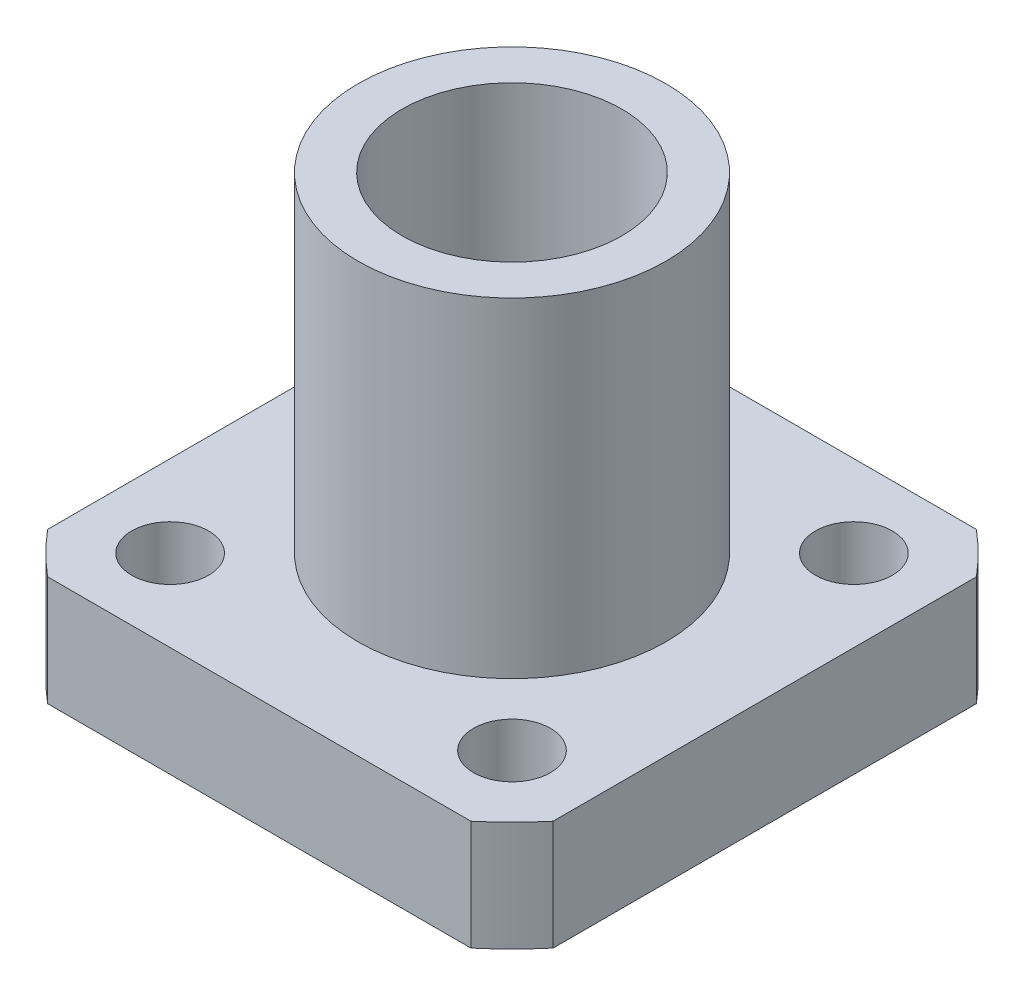
ISO-10303-21;
HEADER;
FILE_DESCRIPTION(('STEP AP214'),'2;1');
FILE_NAME('part.step','',(''),(''),'','','');
FILE_SCHEMA(('AUTOMOTIVE_DESIGN { 1 0 10303 214 1 1 1 1 }'));
ENDSEC;
DATA;
#1=APPLICATION_CONTEXT('core data for automotive mechanical design processes');
#2=APPLICATION_PROTOCOL_DEFINITION('international standard','automotive_design',2000,#1);
#3=PRODUCT_CONTEXT('',#1,'mechanical');
#4=PRODUCT('Part','Part','',(#3));
#5=PRODUCT_RELATED_PRODUCT_CATEGORY('part','',(#4));
#6=PRODUCT_DEFINITION_FORMATION('','',#4);
#7=PRODUCT_DEFINITION_CONTEXT('part definition',#1,'design');
#8=PRODUCT_DEFINITION('design','',#6,#7);
#9=PRODUCT_DEFINITION_SHAPE('','',#8);
#10=(LENGTH_UNIT() NAMED_UNIT(*) SI_UNIT(.MILLI.,.METRE.));
#11=(NAMED_UNIT(*) PLANE_ANGLE_UNIT() SI_UNIT($,.RADIAN.));
#12=(NAMED_UNIT(*) SI_UNIT($,.STERADIAN.) SOLID_ANGLE_UNIT());
#13=UNCERTAINTY_MEASURE_WITH_UNIT(LENGTH_MEASURE(1.E-05),#10,'distance_accuracy_value','');
#14=(GEOMETRIC_REPRESENTATION_CONTEXT(3) GLOBAL_UNCERTAINTY_ASSIGNED_CONTEXT((#13)) GLOBAL_UNIT_ASSIGNED_CONTEXT((#10,
#11,#12)) REPRESENTATION_CONTEXT('',''));
#15=CARTESIAN_POINT('',(0.,0.,0.));
#16=DIRECTION('',(0.,0.,1.));
#17=DIRECTION('',(1.,0.,0.));
#18=AXIS2_PLACEMENT_3D('',#15,#16,#17);
#19=CARTESIAN_POINT('',(0.,5.,0.));
#20=DIRECTION('',(0.,1.,0.));
#21=DIRECTION('',(0.,0.,1.));
#22=AXIS2_PLACEMENT_3D('',#19,#20,#21);
#23=PLANE('',#22);
#24=CARTESIAN_POINT('',(0.,5.,0.));
#25=DIRECTION('',(0.,1.,0.));
#26=DIRECTION('',(0.,0.,1.));
#27=AXIS2_PLACEMENT_3D('',#24,#25,#26);
#28=CIRCLE('',#27,7.);
#29=CARTESIAN_POINT('',(0.,5.,7.));
#30=VERTEX_POINT('',#29);
#31=EDGE_CURVE('E242',#30,#30,#28,.T.);
#32=ORIENTED_EDGE('',*,*,#31,.F.);
#33=EDGE_LOOP('',(#32));
#34=FACE_BOUND('',#33,.T.);
#35=CARTESIAN_POINT('',(-7.77817459305203,5.,7.77817459305202));
#36=DIRECTION('',(0.,1.,0.));
#37=DIRECTION('',(0.,0.,1.));
#38=AXIS2_PLACEMENT_3D('',#35,#36,#37);
#39=CIRCLE('',#38,1.75);
#40=CARTESIAN_POINT('',(-7.77817459305203,5.,9.52817459305202));
#41=VERTEX_POINT('',#40);
#42=EDGE_CURVE('E222',#41,#41,#39,.T.);
#43=ORIENTED_EDGE('',*,*,#42,.F.);
#44=EDGE_LOOP('',(#43));
#45=FACE_BOUND('',#44,.T.);
#46=CARTESIAN_POINT('',(-7.77817459305203,5.,-7.77817459305202));
#47=DIRECTION('',(0.,1.,0.));
#48=DIRECTION('',(0.,0.,1.));
#49=AXIS2_PLACEMENT_3D('',#46,#47,#48);
#50=CIRCLE('',#49,1.75);
#51=CARTESIAN_POINT('',(-7.77817459305203,5.,-6.02817459305202));
#52=VERTEX_POINT('',#51);
#53=EDGE_CURVE('E147',#52,#52,#50,.T.);
#54=ORIENTED_EDGE('',*,*,#53,.F.);
#55=EDGE_LOOP('',(#54));
#56=FACE_BOUND('',#55,.T.);
#57=CARTESIAN_POINT('',(0.,5.,0.));
#58=DIRECTION('',(0.,1.,0.));
#59=DIRECTION('',(0.,0.,1.));
#60=AXIS2_PLACEMENT_3D('',#57,#58,#59);
#61=CIRCLE('',#60,15.);
#62=CARTESIAN_POINT('',(11.5,5.,-9.63068014212912));
#63=VERTEX_POINT('',#62);
#64=CARTESIAN_POINT('',(9.63068014212911,5.,-11.5));
#65=VERTEX_POINT('',#64);
#66=EDGE_CURVE('E165',#63,#65,#61,.T.);
#67=ORIENTED_EDGE('',*,*,#66,.T.);
#68=DIRECTION('',(-1.,0.,0.));
#69=VECTOR('',#68,1.);
#70=CARTESIAN_POINT('',(-9.63068014212912,5.,-11.5));
#71=LINE('',#70,#69);
#72=CARTESIAN_POINT('',(-9.63068014212912,5.,-11.5));
#73=VERTEX_POINT('',#72);
#74=EDGE_CURVE('E101',#65,#73,#71,.T.);
#75=ORIENTED_EDGE('',*,*,#74,.T.);
#76=CARTESIAN_POINT('',(0.,5.,0.));
#77=DIRECTION('',(0.,1.,0.));
#78=DIRECTION('',(0.,0.,1.));
#79=AXIS2_PLACEMENT_3D('',#76,#77,#78);
#80=CIRCLE('',#79,15.);
#81=CARTESIAN_POINT('',(-11.5,5.,-9.6306801421291));
#82=VERTEX_POINT('',#81);
#83=EDGE_CURVE('E186',#73,#82,#80,.T.);
#84=ORIENTED_EDGE('',*,*,#83,.T.);
#85=DIRECTION('',(0.,0.,1.));
#86=VECTOR('',#85,1.);
#87=CARTESIAN_POINT('',(-11.5,5.,9.6306801421291));
#88=LINE('',#87,#86);
#89=CARTESIAN_POINT('',(-11.5,5.,9.6306801421291));
#90=VERTEX_POINT('',#89);
#91=EDGE_CURVE('E200',#82,#90,#88,.T.);
#92=ORIENTED_EDGE('',*,*,#91,.T.);
#93=CARTESIAN_POINT('',(0.,5.,0.));
#94=DIRECTION('',(0.,1.,0.));
#95=DIRECTION('',(0.,0.,1.));
#96=AXIS2_PLACEMENT_3D('',#93,#94,#95);
#97=CIRCLE('',#96,15.);
#98=CARTESIAN_POINT('',(-9.63068014212911,5.,11.5));
#99=VERTEX_POINT('',#98);
#100=EDGE_CURVE('E120',#90,#99,#97,.T.);
#101=ORIENTED_EDGE('',*,*,#100,.T.);
#102=DIRECTION('',(1.,0.,0.));
#103=VECTOR('',#102,1.);
#104=CARTESIAN_POINT('',(-9.63068014212911,5.,11.5));
#105=LINE('',#104,#103);
#106=CARTESIAN_POINT('',(9.63068014212911,5.,11.5));
#107=VERTEX_POINT('',#106);
#108=EDGE_CURVE('E114',#99,#107,#105,.T.);
#109=ORIENTED_EDGE('',*,*,#108,.T.);
#110=CARTESIAN_POINT('',(0.,5.,0.));
#111=DIRECTION('',(0.,1.,0.));
#112=DIRECTION('',(0.,0.,1.));
#113=AXIS2_PLACEMENT_3D('',#110,#111,#112);
#114=CIRCLE('',#113,15.);
#115=CARTESIAN_POINT('',(11.5,5.,9.63068014212912));
#116=VERTEX_POINT('',#115);
#117=EDGE_CURVE('E118',#107,#116,#114,.T.);
#118=ORIENTED_EDGE('',*,*,#117,.T.);
#119=DIRECTION('',(0.,0.,-1.));
#120=VECTOR('',#119,1.);
#121=CARTESIAN_POINT('',(11.5,5.,9.63068014212912));
#122=LINE('',#121,#120);
#123=EDGE_CURVE('E58',#116,#63,#122,.T.);
#124=ORIENTED_EDGE('',*,*,#123,.T.);
#125=EDGE_LOOP('',(#67,#75,#84,#92,#101,#109,#118,#124));
#126=FACE_BOUND('',#125,.T.);
#127=CARTESIAN_POINT('',(7.77817459305202,5.,-7.77817459305203));
#128=DIRECTION('',(0.,1.,0.));
#129=DIRECTION('',(0.,0.,1.));
#130=AXIS2_PLACEMENT_3D('',#127,#128,#129);
#131=CIRCLE('',#130,1.75);
#132=CARTESIAN_POINT('',(7.77817459305202,5.,-6.02817459305203));
#133=VERTEX_POINT('',#132);
#134=EDGE_CURVE('E214',#133,#133,#131,.T.);
#135=ORIENTED_EDGE('',*,*,#134,.F.);
#136=EDGE_LOOP('',(#135));
#137=FACE_BOUND('',#136,.T.);
#138=CARTESIAN_POINT('',(7.77817459305202,5.,7.77817459305203));
#139=DIRECTION('',(0.,1.,0.));
#140=DIRECTION('',(0.,0.,1.));
#141=AXIS2_PLACEMENT_3D('',#138,#139,#140);
#142=CIRCLE('',#141,1.75);
#143=CARTESIAN_POINT('',(7.77817459305202,5.,9.52817459305203));
#144=VERTEX_POINT('',#143);
#145=EDGE_CURVE('E230',#144,#144,#142,.T.);
#146=ORIENTED_EDGE('',*,*,#145,.F.);
#147=EDGE_LOOP('',(#146));
#148=FACE_BOUND('',#147,.T.);
#149=ADVANCED_FACE('F40',(#34,#45,#56,#126,#137,#148),#23,.T.);
#150=CARTESIAN_POINT('',(0.,0.,0.));
#151=DIRECTION('',(0.,1.,0.));
#152=DIRECTION('',(0.,0.,1.));
#153=AXIS2_PLACEMENT_3D('',#150,#151,#152);
#154=PLANE('',#153);
#155=CARTESIAN_POINT('',(0.,0.,0.));
#156=DIRECTION('',(0.,1.,0.));
#157=DIRECTION('',(0.,0.,1.));
#158=AXIS2_PLACEMENT_3D('',#155,#156,#157);
#159=CIRCLE('',#158,5.);
#160=CARTESIAN_POINT('',(0.,0.,5.));
#161=VERTEX_POINT('',#160);
#162=EDGE_CURVE('E246',#161,#161,#159,.T.);
#163=ORIENTED_EDGE('',*,*,#162,.T.);
#164=EDGE_LOOP('',(#163));
#165=FACE_BOUND('',#164,.T.);
#166=CARTESIAN_POINT('',(0.,0.,0.));
#167=DIRECTION('',(0.,1.,0.));
#168=DIRECTION('',(0.,0.,1.));
#169=AXIS2_PLACEMENT_3D('',#166,#167,#168);
#170=CIRCLE('',#169,15.);
#171=CARTESIAN_POINT('',(11.5,0.,-9.63068014212912));
#172=VERTEX_POINT('',#171);
#173=CARTESIAN_POINT('',(9.63068014212911,0.,-11.5));
#174=VERTEX_POINT('',#173);
#175=EDGE_CURVE('E142',#172,#174,#170,.T.);
#176=ORIENTED_EDGE('',*,*,#175,.F.);
#177=DIRECTION('',(0.,0.,-1.));
#178=VECTOR('',#177,1.);
#179=CARTESIAN_POINT('',(11.5,0.,9.63068014212912));
#180=LINE('',#179,#178);
#181=CARTESIAN_POINT('',(11.5,0.,9.63068014212912));
#182=VERTEX_POINT('',#181);
#183=EDGE_CURVE('E93',#182,#172,#180,.T.);
#184=ORIENTED_EDGE('',*,*,#183,.F.);
#185=CARTESIAN_POINT('',(0.,0.,0.));
#186=DIRECTION('',(0.,1.,0.));
#187=DIRECTION('',(0.,0.,1.));
#188=AXIS2_PLACEMENT_3D('',#185,#186,#187);
#189=CIRCLE('',#188,15.);
#190=CARTESIAN_POINT('',(9.63068014212911,0.,11.5));
#191=VERTEX_POINT('',#190);
#192=EDGE_CURVE('E87',#191,#182,#189,.T.);
#193=ORIENTED_EDGE('',*,*,#192,.F.);
#194=DIRECTION('',(1.,0.,0.));
#195=VECTOR('',#194,1.);
#196=CARTESIAN_POINT('',(-9.63068014212911,0.,11.5));
#197=LINE('',#196,#195);
#198=CARTESIAN_POINT('',(-9.63068014212911,0.,11.5));
#199=VERTEX_POINT('',#198);
#200=EDGE_CURVE('E129',#199,#191,#197,.T.);
#201=ORIENTED_EDGE('',*,*,#200,.F.);
#202=CARTESIAN_POINT('',(0.,0.,0.));
#203=DIRECTION('',(0.,1.,0.));
#204=DIRECTION('',(0.,0.,1.));
#205=AXIS2_PLACEMENT_3D('',#202,#203,#204);
#206=CIRCLE('',#205,15.);
#207=CARTESIAN_POINT('',(-11.5,0.,9.6306801421291));
#208=VERTEX_POINT('',#207);
#209=EDGE_CURVE('E156',#208,#199,#206,.T.);
#210=ORIENTED_EDGE('',*,*,#209,.F.);
#211=DIRECTION('',(0.,0.,1.));
#212=VECTOR('',#211,1.);
#213=CARTESIAN_POINT('',(-11.5,0.,9.6306801421291));
#214=LINE('',#213,#212);
#215=CARTESIAN_POINT('',(-11.5,0.,-9.6306801421291));
#216=VERTEX_POINT('',#215);
#217=EDGE_CURVE('E153',#216,#208,#214,.T.);
#218=ORIENTED_EDGE('',*,*,#217,.F.);
#219=CARTESIAN_POINT('',(0.,0.,0.));
#220=DIRECTION('',(0.,1.,0.));
#221=DIRECTION('',(0.,0.,1.));
#222=AXIS2_PLACEMENT_3D('',#219,#220,#221);
#223=CIRCLE('',#222,15.);
#224=CARTESIAN_POINT('',(-9.63068014212912,0.,-11.5));
#225=VERTEX_POINT('',#224);
#226=EDGE_CURVE('E150',#225,#216,#223,.T.);
#227=ORIENTED_EDGE('',*,*,#226,.F.);
#228=DIRECTION('',(-1.,0.,0.));
#229=VECTOR('',#228,1.);
#230=CARTESIAN_POINT('',(-9.63068014212912,0.,-11.5));
#231=LINE('',#230,#229);
#232=EDGE_CURVE('E146',#174,#225,#231,.T.);
#233=ORIENTED_EDGE('',*,*,#232,.F.);
#234=EDGE_LOOP('',(#176,#184,#193,#201,#210,#218,#227,#233));
#235=FACE_BOUND('',#234,.T.);
#236=CARTESIAN_POINT('',(-7.77817459305203,0.,-7.77817459305202));
#237=DIRECTION('',(0.,1.,0.));
#238=DIRECTION('',(0.,0.,1.));
#239=AXIS2_PLACEMENT_3D('',#236,#237,#238);
#240=CIRCLE('',#239,1.75);
#241=CARTESIAN_POINT('',(-7.77817459305203,0.,-6.02817459305202));
#242=VERTEX_POINT('',#241);
#243=EDGE_CURVE('E210',#242,#242,#240,.T.);
#244=ORIENTED_EDGE('',*,*,#243,.T.);
#245=EDGE_LOOP('',(#244));
#246=FACE_BOUND('',#245,.T.);
#247=CARTESIAN_POINT('',(7.77817459305202,0.,-7.77817459305203));
#248=DIRECTION('',(0.,1.,0.));
#249=DIRECTION('',(0.,0.,1.));
#250=AXIS2_PLACEMENT_3D('',#247,#248,#249);
#251=CIRCLE('',#250,1.75);
#252=CARTESIAN_POINT('',(7.77817459305202,0.,-6.02817459305203));
#253=VERTEX_POINT('',#252);
#254=EDGE_CURVE('E218',#253,#253,#251,.T.);
#255=ORIENTED_EDGE('',*,*,#254,.T.);
#256=EDGE_LOOP('',(#255));
#257=FACE_BOUND('',#256,.T.);
#258=CARTESIAN_POINT('',(-7.77817459305203,0.,7.77817459305202));
#259=DIRECTION('',(0.,1.,0.));
#260=DIRECTION('',(0.,0.,1.));
#261=AXIS2_PLACEMENT_3D('',#258,#259,#260);
#262=CIRCLE('',#261,1.75);
#263=CARTESIAN_POINT('',(-7.77817459305203,0.,9.52817459305202));
#264=VERTEX_POINT('',#263);
#265=EDGE_CURVE('E226',#264,#264,#262,.T.);
#266=ORIENTED_EDGE('',*,*,#265,.T.);
#267=EDGE_LOOP('',(#266));
#268=FACE_BOUND('',#267,.T.);
#269=CARTESIAN_POINT('',(7.77817459305202,0.,7.77817459305203));
#270=DIRECTION('',(0.,1.,0.));
#271=DIRECTION('',(0.,0.,1.));
#272=AXIS2_PLACEMENT_3D('',#269,#270,#271);
#273=CIRCLE('',#272,1.75);
#274=CARTESIAN_POINT('',(7.77817459305202,0.,9.52817459305203));
#275=VERTEX_POINT('',#274);
#276=EDGE_CURVE('E234',#275,#275,#273,.T.);
#277=ORIENTED_EDGE('',*,*,#276,.T.);
#278=EDGE_LOOP('',(#277));
#279=FACE_BOUND('',#278,.T.);
#280=ADVANCED_FACE('F190',(#165,#235,#246,#257,#268,#279),#154,.F.);
#281=CARTESIAN_POINT('',(0.,5.,0.));
#282=DIRECTION('',(0.,-1.,0.));
#283=DIRECTION('',(0.,0.,-1.));
#284=AXIS2_PLACEMENT_3D('',#281,#282,#283);
#285=CYLINDRICAL_SURFACE('',#284,15.);
#286=ORIENTED_EDGE('',*,*,#175,.T.);
#287=DIRECTION('',(0.,-1.,0.));
#288=VECTOR('',#287,1.);
#289=CARTESIAN_POINT('',(9.63068014212911,5.,-11.5));
#290=LINE('',#289,#288);
#291=EDGE_CURVE('E11',#65,#174,#290,.T.);
#292=ORIENTED_EDGE('',*,*,#291,.F.);
#293=ORIENTED_EDGE('',*,*,#66,.F.);
#294=DIRECTION('',(0.,-1.,0.));
#295=VECTOR('',#294,1.);
#296=CARTESIAN_POINT('',(11.5,5.,-9.63068014212912));
#297=LINE('',#296,#295);
#298=EDGE_CURVE('E138',#63,#172,#297,.T.);
#299=ORIENTED_EDGE('',*,*,#298,.T.);
#300=EDGE_LOOP('',(#286,#292,#293,#299));
#301=FACE_BOUND('',#300,.T.);
#302=ADVANCED_FACE('F42',(#301),#285,.T.);
#303=CARTESIAN_POINT('',(-9.63068014212912,5.,-11.5));
#304=DIRECTION('',(0.,0.,1.));
#305=DIRECTION('',(1.,0.,0.));
#306=AXIS2_PLACEMENT_3D('',#303,#304,#305);
#307=PLANE('',#306);
#308=ORIENTED_EDGE('',*,*,#232,.T.);
#309=DIRECTION('',(0.,-1.,0.));
#310=VECTOR('',#309,1.);
#311=CARTESIAN_POINT('',(-9.63068014212912,5.,-11.5));
#312=LINE('',#311,#310);
#313=EDGE_CURVE('E50',#73,#225,#312,.T.);
#314=ORIENTED_EDGE('',*,*,#313,.F.);
#315=ORIENTED_EDGE('',*,*,#74,.F.);
#316=ORIENTED_EDGE('',*,*,#291,.T.);
#317=EDGE_LOOP('',(#308,#314,#315,#316));
#318=FACE_BOUND('',#317,.T.);
#319=ADVANCED_FACE('F325',(#318),#307,.F.);
#320=CARTESIAN_POINT('',(0.,5.,0.));
#321=DIRECTION('',(0.,-1.,0.));
#322=DIRECTION('',(0.,0.,-1.));
#323=AXIS2_PLACEMENT_3D('',#320,#321,#322);
#324=CYLINDRICAL_SURFACE('',#323,15.);
#325=ORIENTED_EDGE('',*,*,#226,.T.);
#326=DIRECTION('',(0.,-1.,0.));
#327=VECTOR('',#326,1.);
#328=CARTESIAN_POINT('',(-11.5,5.,-9.6306801421291));
#329=LINE('',#328,#327);
#330=EDGE_CURVE('E176',#82,#216,#329,.T.);
#331=ORIENTED_EDGE('',*,*,#330,.F.);
#332=ORIENTED_EDGE('',*,*,#83,.F.);
#333=ORIENTED_EDGE('',*,*,#313,.T.);
#334=EDGE_LOOP('',(#325,#331,#332,#333));
#335=FACE_BOUND('',#334,.T.);
#336=ADVANCED_FACE('F184',(#335),#324,.T.);
#337=CARTESIAN_POINT('',(-11.5,5.,9.6306801421291));
#338=DIRECTION('',(1.,0.,0.));
#339=DIRECTION('',(0.,0.,-1.));
#340=AXIS2_PLACEMENT_3D('',#337,#338,#339);
#341=PLANE('',#340);
#342=ORIENTED_EDGE('',*,*,#217,.T.);
#343=DIRECTION('',(0.,-1.,0.));
#344=VECTOR('',#343,1.);
#345=CARTESIAN_POINT('',(-11.5,5.,9.6306801421291));
#346=LINE('',#345,#344);
#347=EDGE_CURVE('E172',#90,#208,#346,.T.);
#348=ORIENTED_EDGE('',*,*,#347,.F.);
#349=ORIENTED_EDGE('',*,*,#91,.F.);
#350=ORIENTED_EDGE('',*,*,#330,.T.);
#351=EDGE_LOOP('',(#342,#348,#349,#350));
#352=FACE_BOUND('',#351,.T.);
#353=ADVANCED_FACE('F195',(#352),#341,.F.);
#354=CARTESIAN_POINT('',(0.,5.,0.));
#355=DIRECTION('',(0.,-1.,0.));
#356=DIRECTION('',(0.,0.,-1.));
#357=AXIS2_PLACEMENT_3D('',#354,#355,#356);
#358=CYLINDRICAL_SURFACE('',#357,15.);
#359=ORIENTED_EDGE('',*,*,#209,.T.);
#360=DIRECTION('',(0.,-1.,0.));
#361=VECTOR('',#360,1.);
#362=CARTESIAN_POINT('',(-9.63068014212911,5.,11.5));
#363=LINE('',#362,#361);
#364=EDGE_CURVE('E131',#99,#199,#363,.T.);
#365=ORIENTED_EDGE('',*,*,#364,.F.);
#366=ORIENTED_EDGE('',*,*,#100,.F.);
#367=ORIENTED_EDGE('',*,*,#347,.T.);
#368=EDGE_LOOP('',(#359,#365,#366,#367));
#369=FACE_BOUND('',#368,.T.);
#370=ADVANCED_FACE('F198',(#369),#358,.T.);
#371=CARTESIAN_POINT('',(-9.63068014212911,5.,11.5));
#372=DIRECTION('',(0.,0.,-1.));
#373=DIRECTION('',(-1.,0.,0.));
#374=AXIS2_PLACEMENT_3D('',#371,#372,#373);
#375=PLANE('',#374);
#376=ORIENTED_EDGE('',*,*,#200,.T.);
#377=DIRECTION('',(0.,-1.,0.));
#378=VECTOR('',#377,1.);
#379=CARTESIAN_POINT('',(9.63068014212911,5.,11.5));
#380=LINE('',#379,#378);
#381=EDGE_CURVE('E126',#107,#191,#380,.T.);
#382=ORIENTED_EDGE('',*,*,#381,.F.);
#383=ORIENTED_EDGE('',*,*,#108,.F.);
#384=ORIENTED_EDGE('',*,*,#364,.T.);
#385=EDGE_LOOP('',(#376,#382,#383,#384));
#386=FACE_BOUND('',#385,.T.);
#387=ADVANCED_FACE('F127',(#386),#375,.F.);
#388=CARTESIAN_POINT('',(0.,5.,0.));
#389=DIRECTION('',(0.,-1.,0.));
#390=DIRECTION('',(0.,0.,-1.));
#391=AXIS2_PLACEMENT_3D('',#388,#389,#390);
#392=CYLINDRICAL_SURFACE('',#391,15.);
#393=ORIENTED_EDGE('',*,*,#192,.T.);
#394=DIRECTION('',(0.,-1.,0.));
#395=VECTOR('',#394,1.);
#396=CARTESIAN_POINT('',(11.5,5.,9.63068014212912));
#397=LINE('',#396,#395);
#398=EDGE_CURVE('E132',#116,#182,#397,.T.);
#399=ORIENTED_EDGE('',*,*,#398,.F.);
#400=ORIENTED_EDGE('',*,*,#117,.F.);
#401=ORIENTED_EDGE('',*,*,#381,.T.);
#402=EDGE_LOOP('',(#393,#399,#400,#401));
#403=FACE_BOUND('',#402,.T.);
#404=ADVANCED_FACE('F134',(#403),#392,.T.);
#405=CARTESIAN_POINT('',(11.5,5.,9.63068014212912));
#406=DIRECTION('',(-1.,0.,0.));
#407=DIRECTION('',(0.,0.,1.));
#408=AXIS2_PLACEMENT_3D('',#405,#406,#407);
#409=PLANE('',#408);
#410=ORIENTED_EDGE('',*,*,#183,.T.);
#411=ORIENTED_EDGE('',*,*,#298,.F.);
#412=ORIENTED_EDGE('',*,*,#123,.F.);
#413=ORIENTED_EDGE('',*,*,#398,.T.);
#414=EDGE_LOOP('',(#410,#411,#412,#413));
#415=FACE_BOUND('',#414,.T.);
#416=ADVANCED_FACE('F289',(#415),#409,.F.);
#417=CARTESIAN_POINT('',(-7.77817459305203,5.,-7.77817459305202));
#418=DIRECTION('',(0.,-1.,0.));
#419=DIRECTION('',(0.,0.,-1.));
#420=AXIS2_PLACEMENT_3D('',#417,#418,#419);
#421=CYLINDRICAL_SURFACE('',#420,1.75);
#422=ORIENTED_EDGE('',*,*,#53,.T.);
#423=EDGE_LOOP('',(#422));
#424=FACE_BOUND('',#423,.T.);
#425=ORIENTED_EDGE('',*,*,#243,.F.);
#426=EDGE_LOOP('',(#425));
#427=FACE_BOUND('',#426,.T.);
#428=ADVANCED_FACE('F285',(#424,#427),#421,.F.);
#429=CARTESIAN_POINT('',(7.77817459305202,5.,-7.77817459305203));
#430=DIRECTION('',(0.,-1.,0.));
#431=DIRECTION('',(0.,0.,-1.));
#432=AXIS2_PLACEMENT_3D('',#429,#430,#431);
#433=CYLINDRICAL_SURFACE('',#432,1.75);
#434=ORIENTED_EDGE('',*,*,#134,.T.);
#435=EDGE_LOOP('',(#434));
#436=FACE_BOUND('',#435,.T.);
#437=ORIENTED_EDGE('',*,*,#254,.F.);
#438=EDGE_LOOP('',(#437));
#439=FACE_BOUND('',#438,.T.);
#440=ADVANCED_FACE('F288',(#436,#439),#433,.F.);
#441=CARTESIAN_POINT('',(-7.77817459305203,5.,7.77817459305202));
#442=DIRECTION('',(0.,-1.,0.));
#443=DIRECTION('',(0.,0.,-1.));
#444=AXIS2_PLACEMENT_3D('',#441,#442,#443);
#445=CYLINDRICAL_SURFACE('',#444,1.75);
#446=ORIENTED_EDGE('',*,*,#42,.T.);
#447=EDGE_LOOP('',(#446));
#448=FACE_BOUND('',#447,.T.);
#449=ORIENTED_EDGE('',*,*,#265,.F.);
#450=EDGE_LOOP('',(#449));
#451=FACE_BOUND('',#450,.T.);
#452=ADVANCED_FACE('F302',(#448,#451),#445,.F.);
#453=CARTESIAN_POINT('',(7.77817459305202,5.,7.77817459305203));
#454=DIRECTION('',(0.,-1.,0.));
#455=DIRECTION('',(0.,0.,-1.));
#456=AXIS2_PLACEMENT_3D('',#453,#454,#455);
#457=CYLINDRICAL_SURFACE('',#456,1.75);
#458=ORIENTED_EDGE('',*,*,#145,.T.);
#459=EDGE_LOOP('',(#458));
#460=FACE_BOUND('',#459,.T.);
#461=ORIENTED_EDGE('',*,*,#276,.F.);
#462=EDGE_LOOP('',(#461));
#463=FACE_BOUND('',#462,.T.);
#464=ADVANCED_FACE('F274',(#460,#463),#457,.F.);
#465=CARTESIAN_POINT('',(0.,20.,0.));
#466=DIRECTION('',(0.,-1.,0.));
#467=DIRECTION('',(0.,0.,-1.));
#468=AXIS2_PLACEMENT_3D('',#465,#466,#467);
#469=CYLINDRICAL_SURFACE('',#468,7.);
#470=CARTESIAN_POINT('',(0.,20.,0.));
#471=DIRECTION('',(0.,1.,0.));
#472=DIRECTION('',(0.,0.,1.));
#473=AXIS2_PLACEMENT_3D('',#470,#471,#472);
#474=CIRCLE('',#473,7.);
#475=CARTESIAN_POINT('',(0.,20.,7.));
#476=VERTEX_POINT('',#475);
#477=EDGE_CURVE('E238',#476,#476,#474,.T.);
#478=ORIENTED_EDGE('',*,*,#477,.F.);
#479=EDGE_LOOP('',(#478));
#480=FACE_BOUND('',#479,.T.);
#481=ORIENTED_EDGE('',*,*,#31,.T.);
#482=EDGE_LOOP('',(#481));
#483=FACE_BOUND('',#482,.T.);
#484=ADVANCED_FACE('F268',(#480,#483),#469,.T.);
#485=CARTESIAN_POINT('',(0.,20.,0.));
#486=DIRECTION('',(0.,1.,0.));
#487=DIRECTION('',(0.,0.,1.));
#488=AXIS2_PLACEMENT_3D('',#485,#486,#487);
#489=PLANE('',#488);
#490=CARTESIAN_POINT('',(0.,20.,0.));
#491=DIRECTION('',(0.,1.,0.));
#492=DIRECTION('',(0.,0.,1.));
#493=AXIS2_PLACEMENT_3D('',#490,#491,#492);
#494=CIRCLE('',#493,5.);
#495=CARTESIAN_POINT('',(0.,20.,5.));
#496=VERTEX_POINT('',#495);
#497=EDGE_CURVE('E250',#496,#496,#494,.T.);
#498=ORIENTED_EDGE('',*,*,#497,.F.);
#499=EDGE_LOOP('',(#498));
#500=FACE_BOUND('',#499,.T.);
#501=ORIENTED_EDGE('',*,*,#477,.T.);
#502=EDGE_LOOP('',(#501));
#503=FACE_BOUND('',#502,.T.);
#504=ADVANCED_FACE('F262',(#500,#503),#489,.T.);
#505=CARTESIAN_POINT('',(0.,0.,0.));
#506=DIRECTION('',(0.,1.,0.));
#507=DIRECTION('',(0.,0.,1.));
#508=AXIS2_PLACEMENT_3D('',#505,#506,#507);
#509=CYLINDRICAL_SURFACE('',#508,5.);
#510=ORIENTED_EDGE('',*,*,#162,.F.);
#511=EDGE_LOOP('',(#510));
#512=FACE_BOUND('',#511,.T.);
#513=ORIENTED_EDGE('',*,*,#497,.T.);
#514=EDGE_LOOP('',(#513));
#515=FACE_BOUND('',#514,.T.);
#516=ADVANCED_FACE('F259',(#512,#515),#509,.F.);
#517=CLOSED_SHELL('',(#149,#280,#302,#319,#336,#353,#370,#387,#404,#416,#428,#440,#452,#464,
#484,#504,#516));
#518=MANIFOLD_SOLID_BREP('B2',#517);
#519=ADVANCED_BREP_SHAPE_REPRESENTATION('',(#18,#518),#14);
#520=SHAPE_DEFINITION_REPRESENTATION(#9,#519);
ENDSEC;
END-ISO-10303-21;
